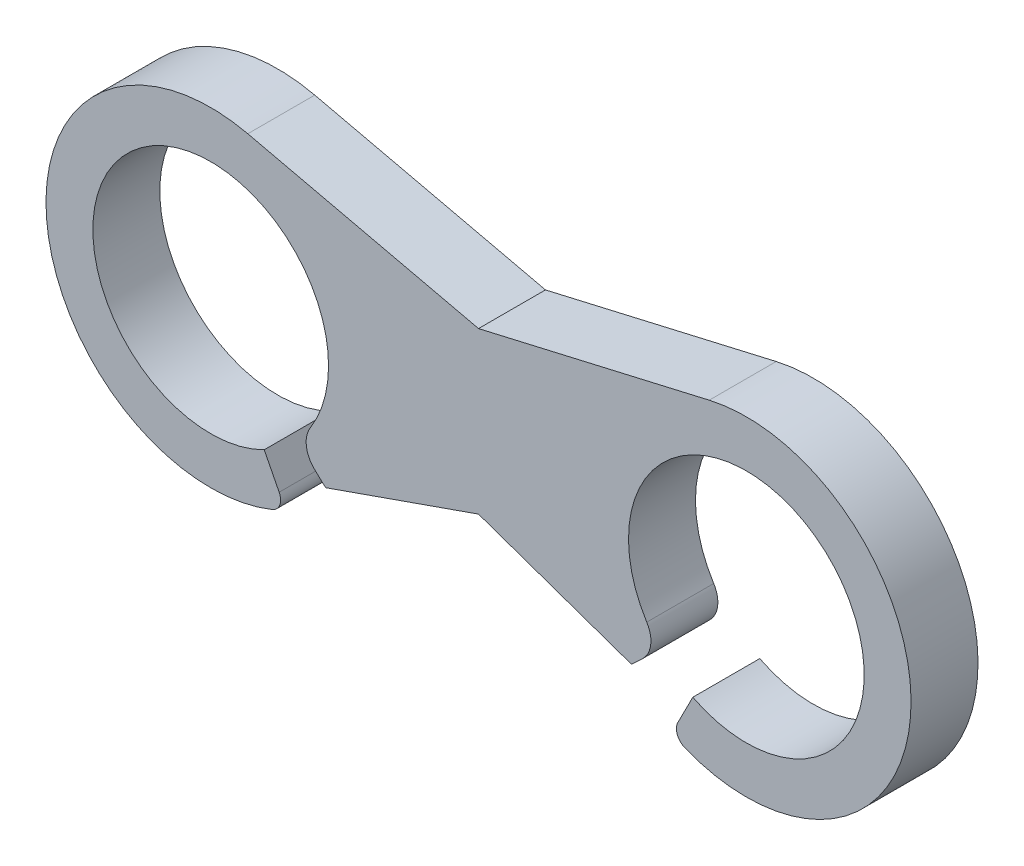
ISO-10303-21;
HEADER;
FILE_DESCRIPTION(('STEP AP214'),'2;1');
FILE_NAME('part.step','',(''),(''),'','','');
FILE_SCHEMA(('AUTOMOTIVE_DESIGN { 1 0 10303 214 1 1 1 1 }'));
ENDSEC;
DATA;
#1=APPLICATION_CONTEXT('core data for automotive mechanical design processes');
#2=APPLICATION_PROTOCOL_DEFINITION('international standard','automotive_design',2000,#1);
#3=PRODUCT_CONTEXT('',#1,'mechanical');
#4=PRODUCT('Part','Part','',(#3));
#5=PRODUCT_RELATED_PRODUCT_CATEGORY('part','',(#4));
#6=PRODUCT_DEFINITION_FORMATION('','',#4);
#7=PRODUCT_DEFINITION_CONTEXT('part definition',#1,'design');
#8=PRODUCT_DEFINITION('design','',#6,#7);
#9=PRODUCT_DEFINITION_SHAPE('','',#8);
#10=(LENGTH_UNIT() NAMED_UNIT(*) SI_UNIT(.MILLI.,.METRE.));
#11=(NAMED_UNIT(*) PLANE_ANGLE_UNIT() SI_UNIT($,.RADIAN.));
#12=(NAMED_UNIT(*) SI_UNIT($,.STERADIAN.) SOLID_ANGLE_UNIT());
#13=UNCERTAINTY_MEASURE_WITH_UNIT(LENGTH_MEASURE(1.E-05),#10,'distance_accuracy_value','');
#14=(GEOMETRIC_REPRESENTATION_CONTEXT(3) GLOBAL_UNCERTAINTY_ASSIGNED_CONTEXT((#13)) GLOBAL_UNIT_ASSIGNED_CONTEXT((#10,
#11,#12)) REPRESENTATION_CONTEXT('',''));
#15=CARTESIAN_POINT('',(0.,0.,0.));
#16=DIRECTION('',(0.,0.,1.));
#17=DIRECTION('',(1.,0.,0.));
#18=AXIS2_PLACEMENT_3D('',#15,#16,#17);
#19=CARTESIAN_POINT('',(5.70840614948504,-4.,2.5));
#20=DIRECTION('',(0.330653496573787,0.943752226595269,0.));
#21=DIRECTION('',(-0.943752226595269,0.330653496573787,0.));
#22=AXIS2_PLACEMENT_3D('',#19,#20,#21);
#23=PLANE('',#22);
#24=DIRECTION('',(0.943752226595269,-0.330653496573787,0.));
#25=VECTOR('',#24,1.);
#26=CARTESIAN_POINT('',(5.70840614948504,-4.,0.));
#27=LINE('',#26,#25);
#28=CARTESIAN_POINT('',(0.,-2.,0.));
#29=VERTEX_POINT('',#28);
#30=CARTESIAN_POINT('',(5.70840614948504,-4.,0.));
#31=VERTEX_POINT('',#30);
#32=EDGE_CURVE('E165',#29,#31,#27,.T.);
#33=ORIENTED_EDGE('',*,*,#32,.T.);
#34=DIRECTION('',(0.,0.,-1.));
#35=VECTOR('',#34,1.);
#36=CARTESIAN_POINT('',(5.70840614948504,-4.,2.5));
#37=LINE('',#36,#35);
#38=CARTESIAN_POINT('',(5.70840614948504,-4.,2.5));
#39=VERTEX_POINT('',#38);
#40=EDGE_CURVE('E235',#39,#31,#37,.T.);
#41=ORIENTED_EDGE('',*,*,#40,.F.);
#42=DIRECTION('',(0.943752226595269,-0.330653496573787,0.));
#43=VECTOR('',#42,1.);
#44=CARTESIAN_POINT('',(5.70840614948504,-4.,2.5));
#45=LINE('',#44,#43);
#46=CARTESIAN_POINT('',(0.,-2.,2.5));
#47=VERTEX_POINT('',#46);
#48=EDGE_CURVE('E203',#47,#39,#45,.T.);
#49=ORIENTED_EDGE('',*,*,#48,.F.);
#50=DIRECTION('',(0.,0.,-1.));
#51=VECTOR('',#50,1.);
#52=CARTESIAN_POINT('',(0.,-2.,2.5));
#53=LINE('',#52,#51);
#54=EDGE_CURVE('E238',#47,#29,#53,.T.);
#55=ORIENTED_EDGE('',*,*,#54,.T.);
#56=EDGE_LOOP('',(#33,#41,#49,#55));
#57=FACE_BOUND('',#56,.T.);
#58=ADVANCED_FACE('F33',(#57),#23,.F.);
#59=CARTESIAN_POINT('',(5.70840614948504,-4.,2.5));
#60=DIRECTION('',(-0.681818181818182,0.731521679065049,0.));
#61=DIRECTION('',(-0.731521679065049,-0.681818181818182,0.));
#62=AXIS2_PLACEMENT_3D('',#59,#60,#61);
#63=PLANE('',#62);
#64=DIRECTION('',(0.731521679065049,0.681818181818182,0.));
#65=VECTOR('',#64,1.);
#66=CARTESIAN_POINT('',(5.70840614948504,-4.,0.));
#67=LINE('',#66,#65);
#68=CARTESIAN_POINT('',(6.11810730324872,-3.61813613493316,0.));
#69=VERTEX_POINT('',#68);
#70=EDGE_CURVE('E218',#31,#69,#67,.T.);
#71=ORIENTED_EDGE('',*,*,#70,.T.);
#72=DIRECTION('',(0.,0.,-1.));
#73=VECTOR('',#72,1.);
#74=CARTESIAN_POINT('',(6.11810730324872,-3.61813613493316,2.5));
#75=LINE('',#74,#73);
#76=CARTESIAN_POINT('',(6.11810730324872,-3.61813613493316,2.5));
#77=VERTEX_POINT('',#76);
#78=EDGE_CURVE('E11',#69,#77,#75,.F.);
#79=ORIENTED_EDGE('',*,*,#78,.T.);
#80=DIRECTION('',(0.731521679065049,0.681818181818182,0.));
#81=VECTOR('',#80,1.);
#82=CARTESIAN_POINT('',(5.70840614948504,-4.,2.5));
#83=LINE('',#82,#81);
#84=EDGE_CURVE('E205',#39,#77,#83,.T.);
#85=ORIENTED_EDGE('',*,*,#84,.F.);
#86=ORIENTED_EDGE('',*,*,#40,.T.);
#87=EDGE_LOOP('',(#71,#79,#85,#86));
#88=FACE_BOUND('',#87,.T.);
#89=ADVANCED_FACE('F323',(#88),#63,.F.);
#90=CARTESIAN_POINT('',(10.,0.,2.5));
#91=DIRECTION('',(0.,0.,-1.));
#92=DIRECTION('',(-1.,0.,0.));
#93=AXIS2_PLACEMENT_3D('',#90,#91,#92);
#94=CYLINDRICAL_SURFACE('',#93,4.4);
#95=CARTESIAN_POINT('',(10.,0.,2.5));
#96=DIRECTION('',(0.,0.,-1.));
#97=DIRECTION('',(1.,0.,0.));
#98=AXIS2_PLACEMENT_3D('',#95,#96,#97);
#99=CIRCLE('',#98,4.4);
#100=CARTESIAN_POINT('',(6.28142076561007,-2.35205622329995,2.5));
#101=VERTEX_POINT('',#100);
#102=CARTESIAN_POINT('',(8.0014761254227,-3.91993652024424,2.5));
#103=VERTEX_POINT('',#102);
#104=EDGE_CURVE('E208',#101,#103,#99,.T.);
#105=ORIENTED_EDGE('',*,*,#104,.F.);
#106=DIRECTION('',(0.,0.,-1.));
#107=VECTOR('',#106,1.);
#108=CARTESIAN_POINT('',(6.28142076561007,-2.35205622329995,2.5));
#109=LINE('',#108,#107);
#110=CARTESIAN_POINT('',(6.28142076561007,-2.35205622329995,0.));
#111=VERTEX_POINT('',#110);
#112=EDGE_CURVE('E41',#101,#111,#109,.T.);
#113=ORIENTED_EDGE('',*,*,#112,.T.);
#114=CARTESIAN_POINT('',(10.,0.,0.));
#115=DIRECTION('',(0.,0.,-1.));
#116=DIRECTION('',(1.,0.,0.));
#117=AXIS2_PLACEMENT_3D('',#114,#115,#116);
#118=CIRCLE('',#117,4.4);
#119=CARTESIAN_POINT('',(8.0014761254227,-3.91993652024424,0.));
#120=VERTEX_POINT('',#119);
#121=EDGE_CURVE('E220',#111,#120,#118,.T.);
#122=ORIENTED_EDGE('',*,*,#121,.T.);
#123=DIRECTION('',(0.,0.,-1.));
#124=VECTOR('',#123,1.);
#125=CARTESIAN_POINT('',(8.0014761254227,-3.91993652024424,2.5));
#126=LINE('',#125,#124);
#127=EDGE_CURVE('E232',#103,#120,#126,.T.);
#128=ORIENTED_EDGE('',*,*,#127,.F.);
#129=EDGE_LOOP('',(#105,#113,#122,#128));
#130=FACE_BOUND('',#129,.T.);
#131=ADVANCED_FACE('F273',(#130),#94,.F.);
#132=CARTESIAN_POINT('',(7.20660867530672,-5.47900218170502,2.5));
#133=DIRECTION('',(0.890894663691873,-0.454209971494842,0.));
#134=DIRECTION('',(0.454209971494842,0.890894663691873,0.));
#135=AXIS2_PLACEMENT_3D('',#132,#133,#134);
#136=PLANE('',#135);
#137=DIRECTION('',(-0.454209971494842,-0.890894663691873,0.));
#138=VECTOR('',#137,1.);
#139=CARTESIAN_POINT('',(7.20660867530672,-5.47900218170502,0.));
#140=LINE('',#139,#138);
#141=CARTESIAN_POINT('',(7.44378230604105,-5.01380604940909,0.));
#142=VERTEX_POINT('',#141);
#143=EDGE_CURVE('E222',#120,#142,#140,.T.);
#144=ORIENTED_EDGE('',*,*,#143,.T.);
#145=DIRECTION('',(0.,0.,-1.));
#146=VECTOR('',#145,1.);
#147=CARTESIAN_POINT('',(7.44378230604105,-5.01380604940909,2.5));
#148=LINE('',#147,#146);
#149=CARTESIAN_POINT('',(7.44378230604105,-5.01380604940909,2.5));
#150=VERTEX_POINT('',#149);
#151=EDGE_CURVE('E256',#142,#150,#148,.F.);
#152=ORIENTED_EDGE('',*,*,#151,.T.);
#153=DIRECTION('',(-0.454209971494842,-0.890894663691873,0.));
#154=VECTOR('',#153,1.);
#155=CARTESIAN_POINT('',(7.20660867530672,-5.47900218170502,2.5));
#156=LINE('',#155,#154);
#157=EDGE_CURVE('E210',#103,#150,#156,.T.);
#158=ORIENTED_EDGE('',*,*,#157,.F.);
#159=ORIENTED_EDGE('',*,*,#127,.T.);
#160=EDGE_LOOP('',(#144,#152,#158,#159));
#161=FACE_BOUND('',#160,.T.);
#162=ADVANCED_FACE('F283',(#161),#136,.F.);
#163=CARTESIAN_POINT('',(10.,0.,2.5));
#164=DIRECTION('',(0.,0.,-1.));
#165=DIRECTION('',(-1.,0.,0.));
#166=AXIS2_PLACEMENT_3D('',#163,#164,#165);
#167=CYLINDRICAL_SURFACE('',#166,6.15);
#168=CARTESIAN_POINT('',(10.,0.,2.5));
#169=DIRECTION('',(0.,0.,1.));
#170=DIRECTION('',(1.,0.,0.));
#171=AXIS2_PLACEMENT_3D('',#168,#169,#170);
#172=CIRCLE('',#171,6.15);
#173=CARTESIAN_POINT('',(7.70243580053186,-5.70470847189603,2.5));
#174=VERTEX_POINT('',#173);
#175=CARTESIAN_POINT('',(8.61451190705024,5.9919047676256,2.5));
#176=VERTEX_POINT('',#175);
#177=EDGE_CURVE('E213',#174,#176,#172,.T.);
#178=ORIENTED_EDGE('',*,*,#177,.F.);
#179=DIRECTION('',(0.,0.,-1.));
#180=VECTOR('',#179,1.);
#181=CARTESIAN_POINT('',(7.70243580053186,-5.70470847189603,2.5));
#182=LINE('',#181,#180);
#183=CARTESIAN_POINT('',(7.70243580053186,-5.70470847189603,0.));
#184=VERTEX_POINT('',#183);
#185=EDGE_CURVE('E253',#174,#184,#182,.T.);
#186=ORIENTED_EDGE('',*,*,#185,.T.);
#187=CARTESIAN_POINT('',(10.,0.,0.));
#188=DIRECTION('',(0.,0.,1.));
#189=DIRECTION('',(1.,0.,0.));
#190=AXIS2_PLACEMENT_3D('',#187,#188,#189);
#191=CIRCLE('',#190,6.15);
#192=CARTESIAN_POINT('',(8.61451190705024,5.9919047676256,0.));
#193=VERTEX_POINT('',#192);
#194=EDGE_CURVE('E225',#184,#193,#191,.T.);
#195=ORIENTED_EDGE('',*,*,#194,.T.);
#196=DIRECTION('',(0.,0.,-1.));
#197=VECTOR('',#196,1.);
#198=CARTESIAN_POINT('',(8.61451190705024,5.9919047676256,2.5));
#199=LINE('',#198,#197);
#200=EDGE_CURVE('E229',#176,#193,#199,.T.);
#201=ORIENTED_EDGE('',*,*,#200,.F.);
#202=EDGE_LOOP('',(#178,#186,#195,#201));
#203=FACE_BOUND('',#202,.T.);
#204=ADVANCED_FACE('F292',(#203),#167,.T.);
#205=CARTESIAN_POINT('',(0.,4.,2.5));
#206=DIRECTION('',(0.225282616739798,-0.974293458150505,0.));
#207=DIRECTION('',(0.974293458150505,0.225282616739798,0.));
#208=AXIS2_PLACEMENT_3D('',#205,#206,#207);
#209=PLANE('',#208);
#210=DIRECTION('',(-0.974293458150505,-0.225282616739798,0.));
#211=VECTOR('',#210,1.);
#212=CARTESIAN_POINT('',(0.,4.,0.));
#213=LINE('',#212,#211);
#214=CARTESIAN_POINT('',(0.,4.,0.));
#215=VERTEX_POINT('',#214);
#216=EDGE_CURVE('E206',#193,#215,#213,.T.);
#217=ORIENTED_EDGE('',*,*,#216,.T.);
#218=DIRECTION('',(0.,0.,-1.));
#219=VECTOR('',#218,1.);
#220=CARTESIAN_POINT('',(0.,4.,2.5));
#221=LINE('',#220,#219);
#222=CARTESIAN_POINT('',(0.,4.,2.5));
#223=VERTEX_POINT('',#222);
#224=EDGE_CURVE('E216',#223,#215,#221,.T.);
#225=ORIENTED_EDGE('',*,*,#224,.F.);
#226=DIRECTION('',(-0.974293458150505,-0.225282616739798,0.));
#227=VECTOR('',#226,1.);
#228=CARTESIAN_POINT('',(0.,4.,2.5));
#229=LINE('',#228,#227);
#230=EDGE_CURVE('E171',#176,#223,#229,.T.);
#231=ORIENTED_EDGE('',*,*,#230,.F.);
#232=ORIENTED_EDGE('',*,*,#200,.T.);
#233=EDGE_LOOP('',(#217,#225,#231,#232));
#234=FACE_BOUND('',#233,.T.);
#235=ADVANCED_FACE('F295',(#234),#209,.F.);
#236=CARTESIAN_POINT('',(10.,0.,2.5));
#237=DIRECTION('',(0.,0.,1.));
#238=DIRECTION('',(1.,0.,0.));
#239=AXIS2_PLACEMENT_3D('',#236,#237,#238);
#240=PLANE('',#239);
#241=CARTESIAN_POINT('',(-10.,0.,2.5));
#242=DIRECTION('',(0.,0.,1.));
#243=DIRECTION('',(-1.,0.,0.));
#244=AXIS2_PLACEMENT_3D('',#241,#242,#243);
#245=CIRCLE('',#244,4.4);
#246=CARTESIAN_POINT('',(-6.28142076561007,-2.35205622329995,2.5));
#247=VERTEX_POINT('',#246);
#248=CARTESIAN_POINT('',(-8.00147612542269,-3.91993652024424,2.5));
#249=VERTEX_POINT('',#248);
#250=EDGE_CURVE('E181',#247,#249,#245,.T.);
#251=ORIENTED_EDGE('',*,*,#250,.F.);
#252=CARTESIAN_POINT('',(-5.43628912143054,-2.88661445586812,2.5));
#253=DIRECTION('',(0.,0.,1.));
#254=DIRECTION('',(1.,0.,0.));
#255=AXIS2_PLACEMENT_3D('',#252,#253,#254);
#256=CIRCLE('',#255,1.);
#257=CARTESIAN_POINT('',(-6.11810730324872,-3.61813613493317,2.5));
#258=VERTEX_POINT('',#257);
#259=EDGE_CURVE('E268',#247,#258,#256,.T.);
#260=ORIENTED_EDGE('',*,*,#259,.T.);
#261=DIRECTION('',(-0.73152167906505,0.681818181818182,0.));
#262=VECTOR('',#261,1.);
#263=CARTESIAN_POINT('',(-5.70840614948504,-4.,2.5));
#264=LINE('',#263,#262);
#265=CARTESIAN_POINT('',(-5.70840614948504,-4.,2.5));
#266=VERTEX_POINT('',#265);
#267=EDGE_CURVE('E183',#266,#258,#264,.T.);
#268=ORIENTED_EDGE('',*,*,#267,.F.);
#269=DIRECTION('',(-0.943752226595269,-0.330653496573787,0.));
#270=VECTOR('',#269,1.);
#271=CARTESIAN_POINT('',(-5.70840614948504,-4.,2.5));
#272=LINE('',#271,#270);
#273=EDGE_CURVE('E186',#47,#266,#272,.T.);
#274=ORIENTED_EDGE('',*,*,#273,.F.);
#275=ORIENTED_EDGE('',*,*,#48,.T.);
#276=ORIENTED_EDGE('',*,*,#84,.T.);
#277=CARTESIAN_POINT('',(5.43628912143054,-2.88661445586811,2.5));
#278=DIRECTION('',(0.,0.,1.));
#279=DIRECTION('',(1.,0.,0.));
#280=AXIS2_PLACEMENT_3D('',#277,#278,#279);
#281=CIRCLE('',#280,1.);
#282=EDGE_CURVE('E48',#77,#101,#281,.T.);
#283=ORIENTED_EDGE('',*,*,#282,.T.);
#284=ORIENTED_EDGE('',*,*,#104,.T.);
#285=ORIENTED_EDGE('',*,*,#157,.T.);
#286=CARTESIAN_POINT('',(7.88922963788699,-5.24091103515651,2.5));
#287=DIRECTION('',(0.,0.,1.));
#288=DIRECTION('',(1.,0.,0.));
#289=AXIS2_PLACEMENT_3D('',#286,#287,#288);
#290=CIRCLE('',#289,0.5);
#291=EDGE_CURVE('E249',#150,#174,#290,.T.);
#292=ORIENTED_EDGE('',*,*,#291,.T.);
#293=ORIENTED_EDGE('',*,*,#177,.T.);
#294=ORIENTED_EDGE('',*,*,#230,.T.);
#295=DIRECTION('',(0.974293458150505,-0.225282616739798,0.));
#296=VECTOR('',#295,1.);
#297=CARTESIAN_POINT('',(0.,4.,2.5));
#298=LINE('',#297,#296);
#299=CARTESIAN_POINT('',(-8.61451190705024,5.9919047676256,2.5));
#300=VERTEX_POINT('',#299);
#301=EDGE_CURVE('E157',#300,#223,#298,.T.);
#302=ORIENTED_EDGE('',*,*,#301,.F.);
#303=CARTESIAN_POINT('',(-10.,0.,2.5));
#304=DIRECTION('',(0.,0.,-1.));
#305=DIRECTION('',(-1.,0.,0.));
#306=AXIS2_PLACEMENT_3D('',#303,#304,#305);
#307=CIRCLE('',#306,6.15);
#308=CARTESIAN_POINT('',(-7.70243580053186,-5.70470847189603,2.5));
#309=VERTEX_POINT('',#308);
#310=EDGE_CURVE('E146',#309,#300,#307,.T.);
#311=ORIENTED_EDGE('',*,*,#310,.F.);
#312=CARTESIAN_POINT('',(-7.88922963788699,-5.24091103515652,2.5));
#313=DIRECTION('',(0.,0.,1.));
#314=DIRECTION('',(1.,0.,0.));
#315=AXIS2_PLACEMENT_3D('',#312,#313,#314);
#316=CIRCLE('',#315,0.5);
#317=CARTESIAN_POINT('',(-7.44378230604105,-5.0138060494091,2.5));
#318=VERTEX_POINT('',#317);
#319=EDGE_CURVE('E251',#309,#318,#316,.T.);
#320=ORIENTED_EDGE('',*,*,#319,.T.);
#321=DIRECTION('',(0.454209971494842,-0.890894663691872,0.));
#322=VECTOR('',#321,1.);
#323=CARTESIAN_POINT('',(-7.20660867530672,-5.47900218170502,2.5));
#324=LINE('',#323,#322);
#325=EDGE_CURVE('E156',#249,#318,#324,.T.);
#326=ORIENTED_EDGE('',*,*,#325,.F.);
#327=EDGE_LOOP('',(#251,#260,#268,#274,#275,#276,#283,#284,#285,#292,#293,#294,#302,#311,#320,#326));
#328=FACE_BOUND('',#327,.T.);
#329=ADVANCED_FACE('F169',(#328),#240,.T.);
#330=CARTESIAN_POINT('',(10.,0.,0.));
#331=DIRECTION('',(0.,0.,1.));
#332=DIRECTION('',(1.,0.,0.));
#333=AXIS2_PLACEMENT_3D('',#330,#331,#332);
#334=PLANE('',#333);
#335=DIRECTION('',(-0.73152167906505,0.681818181818182,0.));
#336=VECTOR('',#335,1.);
#337=CARTESIAN_POINT('',(-5.70840614948504,-4.,0.));
#338=LINE('',#337,#336);
#339=CARTESIAN_POINT('',(-5.70840614948504,-4.,0.));
#340=VERTEX_POINT('',#339);
#341=CARTESIAN_POINT('',(-6.11810730324872,-3.61813613493317,0.));
#342=VERTEX_POINT('',#341);
#343=EDGE_CURVE('E176',#340,#342,#338,.T.);
#344=ORIENTED_EDGE('',*,*,#343,.T.);
#345=CARTESIAN_POINT('',(-5.43628912143054,-2.88661445586812,0.));
#346=DIRECTION('',(0.,0.,1.));
#347=DIRECTION('',(1.,0.,0.));
#348=AXIS2_PLACEMENT_3D('',#345,#346,#347);
#349=CIRCLE('',#348,1.);
#350=CARTESIAN_POINT('',(-6.28142076561007,-2.35205622329995,0.));
#351=VERTEX_POINT('',#350);
#352=EDGE_CURVE('E263',#342,#351,#349,.F.);
#353=ORIENTED_EDGE('',*,*,#352,.T.);
#354=CARTESIAN_POINT('',(-10.,0.,0.));
#355=DIRECTION('',(0.,0.,1.));
#356=DIRECTION('',(-1.,0.,0.));
#357=AXIS2_PLACEMENT_3D('',#354,#355,#356);
#358=CIRCLE('',#357,4.4);
#359=CARTESIAN_POINT('',(-8.00147612542269,-3.91993652024424,0.));
#360=VERTEX_POINT('',#359);
#361=EDGE_CURVE('E196',#351,#360,#358,.T.);
#362=ORIENTED_EDGE('',*,*,#361,.T.);
#363=DIRECTION('',(0.454209971494842,-0.890894663691872,0.));
#364=VECTOR('',#363,1.);
#365=CARTESIAN_POINT('',(-7.20660867530672,-5.47900218170502,0.));
#366=LINE('',#365,#364);
#367=CARTESIAN_POINT('',(-7.44378230604105,-5.0138060494091,0.));
#368=VERTEX_POINT('',#367);
#369=EDGE_CURVE('E193',#360,#368,#366,.T.);
#370=ORIENTED_EDGE('',*,*,#369,.T.);
#371=CARTESIAN_POINT('',(-7.88922963788699,-5.24091103515652,0.));
#372=DIRECTION('',(0.,0.,1.));
#373=DIRECTION('',(1.,0.,0.));
#374=AXIS2_PLACEMENT_3D('',#371,#372,#373);
#375=CIRCLE('',#374,0.5);
#376=CARTESIAN_POINT('',(-7.70243580053186,-5.70470847189603,0.));
#377=VERTEX_POINT('',#376);
#378=EDGE_CURVE('E246',#368,#377,#375,.F.);
#379=ORIENTED_EDGE('',*,*,#378,.T.);
#380=CARTESIAN_POINT('',(-10.,0.,0.));
#381=DIRECTION('',(0.,0.,-1.));
#382=DIRECTION('',(-1.,0.,0.));
#383=AXIS2_PLACEMENT_3D('',#380,#381,#382);
#384=CIRCLE('',#383,6.15);
#385=CARTESIAN_POINT('',(-8.61451190705024,5.9919047676256,0.));
#386=VERTEX_POINT('',#385);
#387=EDGE_CURVE('E191',#377,#386,#384,.T.);
#388=ORIENTED_EDGE('',*,*,#387,.T.);
#389=DIRECTION('',(0.974293458150505,-0.225282616739798,0.));
#390=VECTOR('',#389,1.);
#391=CARTESIAN_POINT('',(0.,4.,0.));
#392=LINE('',#391,#390);
#393=EDGE_CURVE('E164',#386,#215,#392,.T.);
#394=ORIENTED_EDGE('',*,*,#393,.T.);
#395=ORIENTED_EDGE('',*,*,#216,.F.);
#396=ORIENTED_EDGE('',*,*,#194,.F.);
#397=CARTESIAN_POINT('',(7.88922963788699,-5.24091103515651,0.));
#398=DIRECTION('',(0.,0.,1.));
#399=DIRECTION('',(1.,0.,0.));
#400=AXIS2_PLACEMENT_3D('',#397,#398,#399);
#401=CIRCLE('',#400,0.5);
#402=EDGE_CURVE('E244',#184,#142,#401,.F.);
#403=ORIENTED_EDGE('',*,*,#402,.T.);
#404=ORIENTED_EDGE('',*,*,#143,.F.);
#405=ORIENTED_EDGE('',*,*,#121,.F.);
#406=CARTESIAN_POINT('',(5.43628912143054,-2.88661445586811,0.));
#407=DIRECTION('',(0.,0.,1.));
#408=DIRECTION('',(1.,0.,0.));
#409=AXIS2_PLACEMENT_3D('',#406,#407,#408);
#410=CIRCLE('',#409,1.);
#411=EDGE_CURVE('E261',#111,#69,#410,.F.);
#412=ORIENTED_EDGE('',*,*,#411,.T.);
#413=ORIENTED_EDGE('',*,*,#70,.F.);
#414=ORIENTED_EDGE('',*,*,#32,.F.);
#415=DIRECTION('',(-0.943752226595269,-0.330653496573787,0.));
#416=VECTOR('',#415,1.);
#417=CARTESIAN_POINT('',(-5.70840614948504,-4.,0.));
#418=LINE('',#417,#416);
#419=EDGE_CURVE('E173',#29,#340,#418,.T.);
#420=ORIENTED_EDGE('',*,*,#419,.T.);
#421=EDGE_LOOP('',(#344,#353,#362,#370,#379,#388,#394,#395,#396,#403,#404,#405,#412,#413,#414,#420));
#422=FACE_BOUND('',#421,.T.);
#423=ADVANCED_FACE('F278',(#422),#334,.F.);
#424=CARTESIAN_POINT('',(0.,4.,2.5));
#425=DIRECTION('',(0.225282616739798,0.974293458150505,0.));
#426=DIRECTION('',(-0.974293458150505,0.225282616739798,0.));
#427=AXIS2_PLACEMENT_3D('',#424,#425,#426);
#428=PLANE('',#427);
#429=ORIENTED_EDGE('',*,*,#393,.F.);
#430=DIRECTION('',(0.,0.,-1.));
#431=VECTOR('',#430,1.);
#432=CARTESIAN_POINT('',(-8.61451190705024,5.9919047676256,2.5));
#433=LINE('',#432,#431);
#434=EDGE_CURVE('E150',#300,#386,#433,.T.);
#435=ORIENTED_EDGE('',*,*,#434,.F.);
#436=ORIENTED_EDGE('',*,*,#301,.T.);
#437=ORIENTED_EDGE('',*,*,#224,.T.);
#438=EDGE_LOOP('',(#429,#435,#436,#437));
#439=FACE_BOUND('',#438,.T.);
#440=ADVANCED_FACE('F161',(#439),#428,.T.);
#441=CARTESIAN_POINT('',(-10.,0.,2.5));
#442=DIRECTION('',(0.,0.,-1.));
#443=DIRECTION('',(-1.,0.,0.));
#444=AXIS2_PLACEMENT_3D('',#441,#442,#443);
#445=CYLINDRICAL_SURFACE('',#444,6.15);
#446=ORIENTED_EDGE('',*,*,#387,.F.);
#447=DIRECTION('',(0.,0.,-1.));
#448=VECTOR('',#447,1.);
#449=CARTESIAN_POINT('',(-7.70243580053186,-5.70470847189603,2.5));
#450=LINE('',#449,#448);
#451=EDGE_CURVE('E153',#377,#309,#450,.F.);
#452=ORIENTED_EDGE('',*,*,#451,.T.);
#453=ORIENTED_EDGE('',*,*,#310,.T.);
#454=ORIENTED_EDGE('',*,*,#434,.T.);
#455=EDGE_LOOP('',(#446,#452,#453,#454));
#456=FACE_BOUND('',#455,.T.);
#457=ADVANCED_FACE('F149',(#456),#445,.T.);
#458=CARTESIAN_POINT('',(-7.20660867530672,-5.47900218170502,2.5));
#459=DIRECTION('',(0.890894663691873,0.454209971494842,0.));
#460=DIRECTION('',(-0.454209971494842,0.890894663691873,0.));
#461=AXIS2_PLACEMENT_3D('',#458,#459,#460);
#462=PLANE('',#461);
#463=ORIENTED_EDGE('',*,*,#325,.T.);
#464=DIRECTION('',(0.,0.,-1.));
#465=VECTOR('',#464,1.);
#466=CARTESIAN_POINT('',(-7.44378230604105,-5.0138060494091,2.5));
#467=LINE('',#466,#465);
#468=EDGE_CURVE('E241',#318,#368,#467,.T.);
#469=ORIENTED_EDGE('',*,*,#468,.T.);
#470=ORIENTED_EDGE('',*,*,#369,.F.);
#471=DIRECTION('',(0.,0.,-1.));
#472=VECTOR('',#471,1.);
#473=CARTESIAN_POINT('',(-8.00147612542269,-3.91993652024424,2.5));
#474=LINE('',#473,#472);
#475=EDGE_CURVE('E166',#249,#360,#474,.T.);
#476=ORIENTED_EDGE('',*,*,#475,.F.);
#477=EDGE_LOOP('',(#463,#469,#470,#476));
#478=FACE_BOUND('',#477,.T.);
#479=ADVANCED_FACE('F302',(#478),#462,.T.);
#480=CARTESIAN_POINT('',(-10.,0.,2.5));
#481=DIRECTION('',(0.,0.,-1.));
#482=DIRECTION('',(-1.,0.,0.));
#483=AXIS2_PLACEMENT_3D('',#480,#481,#482);
#484=CYLINDRICAL_SURFACE('',#483,4.4);
#485=ORIENTED_EDGE('',*,*,#361,.F.);
#486=DIRECTION('',(0.,0.,-1.));
#487=VECTOR('',#486,1.);
#488=CARTESIAN_POINT('',(-6.28142076561007,-2.35205622329995,2.5));
#489=LINE('',#488,#487);
#490=EDGE_CURVE('E265',#351,#247,#489,.F.);
#491=ORIENTED_EDGE('',*,*,#490,.T.);
#492=ORIENTED_EDGE('',*,*,#250,.T.);
#493=ORIENTED_EDGE('',*,*,#475,.T.);
#494=EDGE_LOOP('',(#485,#491,#492,#493));
#495=FACE_BOUND('',#494,.T.);
#496=ADVANCED_FACE('F306',(#495),#484,.F.);
#497=CARTESIAN_POINT('',(-5.70840614948504,-4.,2.5));
#498=DIRECTION('',(-0.681818181818182,-0.73152167906505,0.));
#499=DIRECTION('',(0.73152167906505,-0.681818181818181,0.));
#500=AXIS2_PLACEMENT_3D('',#497,#498,#499);
#501=PLANE('',#500);
#502=ORIENTED_EDGE('',*,*,#267,.T.);
#503=DIRECTION('',(0.,0.,-1.));
#504=VECTOR('',#503,1.);
#505=CARTESIAN_POINT('',(-6.11810730324872,-3.61813613493317,2.5));
#506=LINE('',#505,#504);
#507=EDGE_CURVE('E258',#258,#342,#506,.T.);
#508=ORIENTED_EDGE('',*,*,#507,.T.);
#509=ORIENTED_EDGE('',*,*,#343,.F.);
#510=DIRECTION('',(0.,0.,-1.));
#511=VECTOR('',#510,1.);
#512=CARTESIAN_POINT('',(-5.70840614948504,-4.,2.5));
#513=LINE('',#512,#511);
#514=EDGE_CURVE('E189',#266,#340,#513,.T.);
#515=ORIENTED_EDGE('',*,*,#514,.F.);
#516=EDGE_LOOP('',(#502,#508,#509,#515));
#517=FACE_BOUND('',#516,.T.);
#518=ADVANCED_FACE('F315',(#517),#501,.T.);
#519=CARTESIAN_POINT('',(-5.70840614948504,-4.,2.5));
#520=DIRECTION('',(0.330653496573787,-0.943752226595269,0.));
#521=DIRECTION('',(0.943752226595269,0.330653496573787,0.));
#522=AXIS2_PLACEMENT_3D('',#519,#520,#521);
#523=PLANE('',#522);
#524=ORIENTED_EDGE('',*,*,#419,.F.);
#525=ORIENTED_EDGE('',*,*,#54,.F.);
#526=ORIENTED_EDGE('',*,*,#273,.T.);
#527=ORIENTED_EDGE('',*,*,#514,.T.);
#528=EDGE_LOOP('',(#524,#525,#526,#527));
#529=FACE_BOUND('',#528,.T.);
#530=ADVANCED_FACE('F319',(#529),#523,.T.);
#531=CARTESIAN_POINT('',(-7.88922963788699,-5.24091103515652,2.5));
#532=DIRECTION('',(0.,0.,-1.));
#533=DIRECTION('',(-1.,0.,0.));
#534=AXIS2_PLACEMENT_3D('',#531,#532,#533);
#535=CYLINDRICAL_SURFACE('',#534,0.5);
#536=ORIENTED_EDGE('',*,*,#319,.F.);
#537=ORIENTED_EDGE('',*,*,#451,.F.);
#538=ORIENTED_EDGE('',*,*,#378,.F.);
#539=ORIENTED_EDGE('',*,*,#468,.F.);
#540=EDGE_LOOP('',(#536,#537,#538,#539));
#541=FACE_BOUND('',#540,.T.);
#542=ADVANCED_FACE('F297',(#541),#535,.T.);
#543=CARTESIAN_POINT('',(7.88922963788699,-5.24091103515651,2.5));
#544=DIRECTION('',(0.,0.,-1.));
#545=DIRECTION('',(-1.,0.,0.));
#546=AXIS2_PLACEMENT_3D('',#543,#544,#545);
#547=CYLINDRICAL_SURFACE('',#546,0.5);
#548=ORIENTED_EDGE('',*,*,#291,.F.);
#549=ORIENTED_EDGE('',*,*,#151,.F.);
#550=ORIENTED_EDGE('',*,*,#402,.F.);
#551=ORIENTED_EDGE('',*,*,#185,.F.);
#552=EDGE_LOOP('',(#548,#549,#550,#551));
#553=FACE_BOUND('',#552,.T.);
#554=ADVANCED_FACE('F287',(#553),#547,.T.);
#555=CARTESIAN_POINT('',(-5.43628912143054,-2.88661445586812,2.5));
#556=DIRECTION('',(0.,0.,-1.));
#557=DIRECTION('',(-1.,0.,0.));
#558=AXIS2_PLACEMENT_3D('',#555,#556,#557);
#559=CYLINDRICAL_SURFACE('',#558,1.);
#560=ORIENTED_EDGE('',*,*,#259,.F.);
#561=ORIENTED_EDGE('',*,*,#490,.F.);
#562=ORIENTED_EDGE('',*,*,#352,.F.);
#563=ORIENTED_EDGE('',*,*,#507,.F.);
#564=EDGE_LOOP('',(#560,#561,#562,#563));
#565=FACE_BOUND('',#564,.T.);
#566=ADVANCED_FACE('F312',(#565),#559,.T.);
#567=CARTESIAN_POINT('',(5.43628912143054,-2.88661445586811,2.5));
#568=DIRECTION('',(0.,0.,-1.));
#569=DIRECTION('',(-1.,0.,0.));
#570=AXIS2_PLACEMENT_3D('',#567,#568,#569);
#571=CYLINDRICAL_SURFACE('',#570,1.);
#572=ORIENTED_EDGE('',*,*,#282,.F.);
#573=ORIENTED_EDGE('',*,*,#78,.F.);
#574=ORIENTED_EDGE('',*,*,#411,.F.);
#575=ORIENTED_EDGE('',*,*,#112,.F.);
#576=EDGE_LOOP('',(#572,#573,#574,#575));
#577=FACE_BOUND('',#576,.T.);
#578=ADVANCED_FACE('F35',(#577),#571,.T.);
#579=CLOSED_SHELL('',(#58,#89,#131,#162,#204,#235,#329,#423,#440,#457,#479,#496,#518,#530,#542,
#554,#566,#578));
#580=MANIFOLD_SOLID_BREP('B2',#579);
#581=ADVANCED_BREP_SHAPE_REPRESENTATION('',(#18,#580),#14);
#582=SHAPE_DEFINITION_REPRESENTATION(#9,#581);
ENDSEC;
END-ISO-10303-21;
